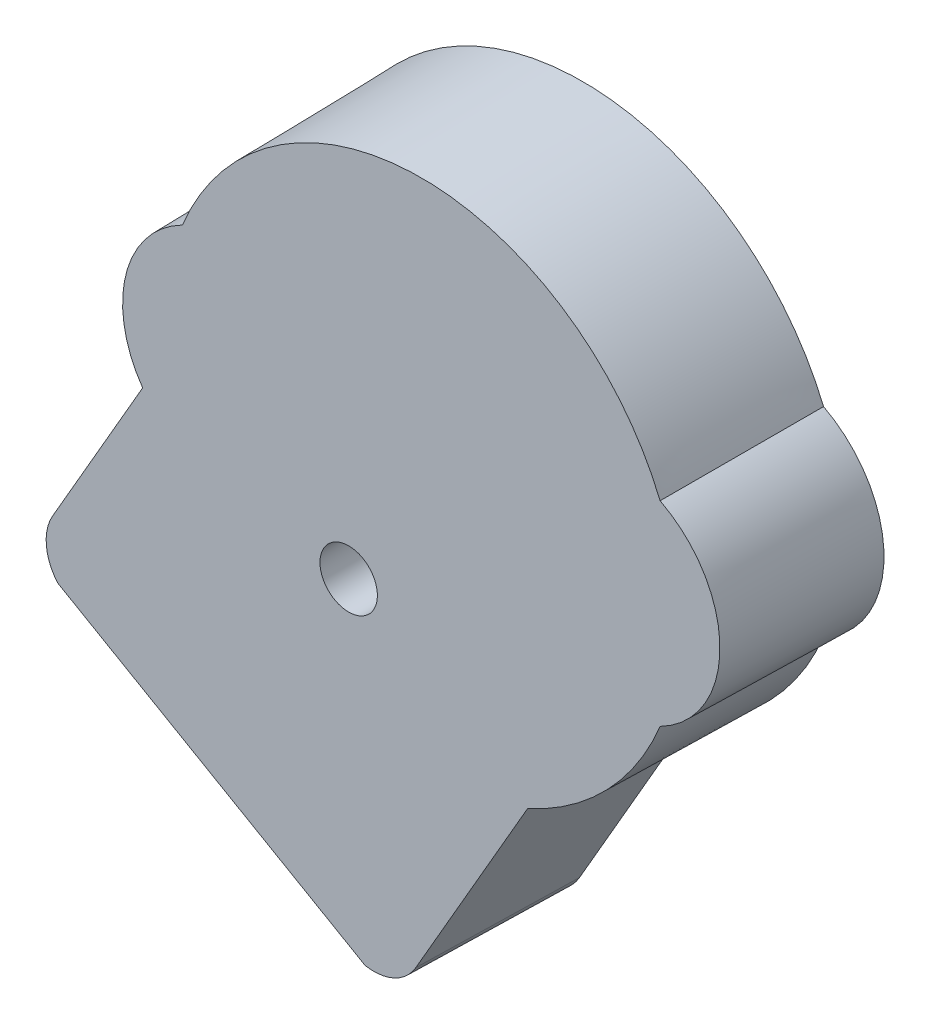
ISO-10303-21;
HEADER;
FILE_DESCRIPTION(('STEP AP214'),'2;1');
FILE_NAME('part.step','',(''),(''),'','','');
FILE_SCHEMA(('AUTOMOTIVE_DESIGN { 1 0 10303 214 1 1 1 1 }'));
ENDSEC;
DATA;
#1=APPLICATION_CONTEXT('core data for automotive mechanical design processes');
#2=APPLICATION_PROTOCOL_DEFINITION('international standard','automotive_design',2000,#1);
#3=PRODUCT_CONTEXT('',#1,'mechanical');
#4=PRODUCT('Part','Part','',(#3));
#5=PRODUCT_RELATED_PRODUCT_CATEGORY('part','',(#4));
#6=PRODUCT_DEFINITION_FORMATION('','',#4);
#7=PRODUCT_DEFINITION_CONTEXT('part definition',#1,'design');
#8=PRODUCT_DEFINITION('design','',#6,#7);
#9=PRODUCT_DEFINITION_SHAPE('','',#8);
#10=(LENGTH_UNIT() NAMED_UNIT(*) SI_UNIT(.MILLI.,.METRE.));
#11=(NAMED_UNIT(*) PLANE_ANGLE_UNIT() SI_UNIT($,.RADIAN.));
#12=(NAMED_UNIT(*) SI_UNIT($,.STERADIAN.) SOLID_ANGLE_UNIT());
#13=UNCERTAINTY_MEASURE_WITH_UNIT(LENGTH_MEASURE(1.E-05),#10,'distance_accuracy_value','');
#14=(GEOMETRIC_REPRESENTATION_CONTEXT(3) GLOBAL_UNCERTAINTY_ASSIGNED_CONTEXT((#13)) GLOBAL_UNIT_ASSIGNED_CONTEXT((#10,
#11,#12)) REPRESENTATION_CONTEXT('',''));
#15=CARTESIAN_POINT('',(0.,0.,0.));
#16=DIRECTION('',(0.,0.,1.));
#17=DIRECTION('',(1.,0.,0.));
#18=AXIS2_PLACEMENT_3D('',#15,#16,#17);
#19=CARTESIAN_POINT('',(-9.40359146757676,3.84682564082614,6.35));
#20=DIRECTION('',(0.,0.,1.));
#21=DIRECTION('',(1.,0.,0.));
#22=AXIS2_PLACEMENT_3D('',#19,#20,#21);
#23=PLANE('',#22);
#24=CARTESIAN_POINT('',(-2.8575,-4.94933518262807,6.35));
#25=DIRECTION('',(0.,0.,1.));
#26=DIRECTION('',(1.,0.,0.));
#27=AXIS2_PLACEMENT_3D('',#24,#25,#26);
#28=CIRCLE('',#27,1.1303);
#29=CARTESIAN_POINT('',(-1.7272,-4.94933518262807,6.35));
#30=VERTEX_POINT('',#29);
#31=EDGE_CURVE('E137',#30,#30,#28,.F.);
#32=ORIENTED_EDGE('',*,*,#31,.T.);
#33=EDGE_LOOP('',(#32));
#34=FACE_BOUND('',#33,.T.);
#35=CARTESIAN_POINT('',(-1.86673868596883,-15.9332862485524,6.35));
#36=DIRECTION('',(0.,0.,1.));
#37=DIRECTION('',(1.,0.,0.));
#38=AXIS2_PLACEMENT_3D('',#35,#36,#37);
#39=CIRCLE('',#38,1.905);
#40=CARTESIAN_POINT('',(-0.216960291759535,-16.8857862485523,6.35));
#41=VERTEX_POINT('',#40);
#42=CARTESIAN_POINT('',(-2.20928277668747,-17.8072362334543,6.35));
#43=VERTEX_POINT('',#42);
#44=EDGE_CURVE('E115',#41,#43,#39,.F.);
#45=ORIENTED_EDGE('',*,*,#44,.F.);
#46=DIRECTION('',(-0.5,-0.866025403784438,0.));
#47=VECTOR('',#46,1.);
#48=CARTESIAN_POINT('',(5.90942251977703,-6.27457995235447,6.35));
#49=LINE('',#48,#47);
#50=CARTESIAN_POINT('',(4.18759685888483,-9.25686947879562,6.35));
#51=VERTEX_POINT('',#50);
#52=EDGE_CURVE('E132',#41,#51,#49,.F.);
#53=ORIENTED_EDGE('',*,*,#52,.T.);
#54=CARTESIAN_POINT('',(0.,0.,6.35));
#55=DIRECTION('',(0.,0.,1.));
#56=DIRECTION('',(1.,0.,0.));
#57=AXIS2_PLACEMENT_3D('',#54,#55,#56);
#58=CIRCLE('',#57,10.16);
#59=CARTESIAN_POINT('',(9.40359146757677,-3.84682564082612,6.35));
#60=VERTEX_POINT('',#59);
#61=EDGE_CURVE('E136',#51,#60,#58,.T.);
#62=ORIENTED_EDGE('',*,*,#61,.T.);
#63=CARTESIAN_POINT('',(7.4422,0.,6.35));
#64=DIRECTION('',(0.,0.,1.));
#65=DIRECTION('',(1.,0.,0.));
#66=AXIS2_PLACEMENT_3D('',#63,#64,#65);
#67=CIRCLE('',#66,4.318);
#68=CARTESIAN_POINT('',(9.40359146757679,3.84682564082607,6.35));
#69=VERTEX_POINT('',#68);
#70=EDGE_CURVE('E84',#69,#60,#67,.F.);
#71=ORIENTED_EDGE('',*,*,#70,.F.);
#72=CARTESIAN_POINT('',(0.,0.,6.35));
#73=DIRECTION('',(0.,0.,1.));
#74=DIRECTION('',(1.,0.,0.));
#75=AXIS2_PLACEMENT_3D('',#72,#73,#74);
#76=CIRCLE('',#75,10.16);
#77=CARTESIAN_POINT('',(-9.40359146757677,3.84682564082612,6.35));
#78=VERTEX_POINT('',#77);
#79=EDGE_CURVE('E116',#69,#78,#76,.T.);
#80=ORIENTED_EDGE('',*,*,#79,.T.);
#81=CARTESIAN_POINT('',(-7.4422,0.,6.35));
#82=DIRECTION('',(0.,0.,1.));
#83=DIRECTION('',(1.,0.,0.));
#84=AXIS2_PLACEMENT_3D('',#81,#82,#83);
#85=CIRCLE('',#84,4.318);
#86=CARTESIAN_POINT('',(-10.9697880402554,-2.49023023398381,6.35));
#87=VERTEX_POINT('',#86);
#88=EDGE_CURVE('E123',#87,#78,#85,.F.);
#89=ORIENTED_EDGE('',*,*,#88,.F.);
#90=DIRECTION('',(0.5,0.866025403784438,0.));
#91=VECTOR('',#90,1.);
#92=CARTESIAN_POINT('',(-8.38865689670405,1.98042004764553,6.35));
#93=LINE('',#92,#91);
#94=CARTESIAN_POINT('',(-14.5150397082405,-8.63078624855234,6.35));
#95=VERTEX_POINT('',#94);
#96=EDGE_CURVE('E111',#87,#95,#93,.F.);
#97=ORIENTED_EDGE('',*,*,#96,.T.);
#98=CARTESIAN_POINT('',(-12.8652613140312,-9.58328624855235,6.35));
#99=DIRECTION('',(0.,0.,1.));
#100=DIRECTION('',(1.,0.,0.));
#101=AXIS2_PLACEMENT_3D('',#98,#99,#100);
#102=CIRCLE('',#101,1.905);
#103=CARTESIAN_POINT('',(-14.3168775610183,-10.8169131254819,6.35));
#104=VERTEX_POINT('',#103);
#105=EDGE_CURVE('E119',#104,#95,#102,.F.);
#106=ORIENTED_EDGE('',*,*,#105,.F.);
#107=DIRECTION('',(-0.866025403784439,0.5,0.));
#108=VECTOR('',#107,1.);
#109=CARTESIAN_POINT('',(0.36870169844507,-19.2956362641387,6.35));
#110=LINE('',#109,#108);
#111=EDGE_CURVE('E124',#43,#104,#110,.T.);
#112=ORIENTED_EDGE('',*,*,#111,.F.);
#113=EDGE_LOOP('',(#45,#53,#62,#71,#80,#89,#97,#106,#112));
#114=FACE_BOUND('',#113,.T.);
#115=ADVANCED_FACE('F17',(#34,#114),#23,.T.);
#116=CARTESIAN_POINT('',(-1.86673868596883,-15.9332862485524,0.));
#117=DIRECTION('',(0.,0.,-1.));
#118=DIRECTION('',(1.,0.,0.));
#119=AXIS2_PLACEMENT_3D('',#116,#117,#118);
#120=CONICAL_SURFACE('',#119,2.01583966229418,0.0174532925199433);
#121=CARTESIAN_POINT('',(-0.216960291747509,-16.8857862485592,6.34999999920876));
#122=DIRECTION('',(0.0151142273318586,-0.00872620321864211,-0.999847695156391));
#123=VECTOR('',#122,1.);
#124=LINE('',#121,#123);
#125=CARTESIAN_POINT('',(-0.120970328465817,-16.9412060796994,0.));
#126=VERTEX_POINT('',#125);
#127=EDGE_CURVE('E38',#41,#126,#124,.T.);
#128=ORIENTED_EDGE('',*,*,#127,.F.);
#129=ORIENTED_EDGE('',*,*,#44,.T.);
#130=CARTESIAN_POINT('',(-2.20928277668747,-17.8072362334543,6.35));
#131=CARTESIAN_POINT('',(-2.21691007592208,-17.8279869152819,5.10198016647171));
#132=CARTESIAN_POINT('',(-2.22456490869139,-17.8487217025208,3.85396023843436));
#133=CARTESIAN_POINT('',(-2.23759435433918,-17.883861355459,1.73729352304294));
#134=CARTESIAN_POINT('',(-2.24295477212802,-17.8982744157151,0.868646784413625));
#135=CARTESIAN_POINT('',(-2.2483285283619,-17.9126797759391,0.));
#136=B_SPLINE_CURVE_WITH_KNOTS('',3,(#130,#131,#132,#133,#134,#135),.UNSPECIFIED.,.F.,.F.,(4,2,
4),(0.,3.74464690161894,6.35099542824493),.UNSPECIFIED.);
#137=CARTESIAN_POINT('',(-2.2483285283619,-17.9126797759391,0.));
#138=VERTEX_POINT('',#137);
#139=EDGE_CURVE('E174',#43,#138,#136,.T.);
#140=ORIENTED_EDGE('',*,*,#139,.T.);
#141=CARTESIAN_POINT('',(-1.86673868596883,-15.9332862485524,0.));
#142=DIRECTION('',(0.,0.,-1.));
#143=DIRECTION('',(-1.,0.,0.));
#144=AXIS2_PLACEMENT_3D('',#141,#142,#143);
#145=CIRCLE('',#144,2.01583966229418);
#146=EDGE_CURVE('E29',#126,#138,#145,.T.);
#147=ORIENTED_EDGE('',*,*,#146,.F.);
#148=EDGE_LOOP('',(#128,#129,#140,#147));
#149=FACE_BOUND('',#148,.T.);
#150=ADVANCED_FACE('F197',(#149),#120,.T.);
#151=CARTESIAN_POINT('',(0.313281867297979,-19.3916262274323,0.));
#152=DIRECTION('',(-0.499923847578195,-0.865893503920755,0.0174524064372835));
#153=DIRECTION('',(0.866025403784439,-0.5,0.));
#154=AXIS2_PLACEMENT_3D('',#151,#152,#153);
#155=PLANE('',#154);
#156=ORIENTED_EDGE('',*,*,#139,.F.);
#157=ORIENTED_EDGE('',*,*,#111,.T.);
#158=CARTESIAN_POINT('',(-14.3168775610183,-10.8169131254819,6.35));
#159=CARTESIAN_POINT('',(-14.3310345290096,-10.8338939012952,5.10198016647171));
#160=CARTESIAN_POINT('',(-14.3451639651159,-10.8508905745546,3.85396023843436));
#161=CARTESIAN_POINT('',(-14.3690810744167,-10.8797442319519,1.73729352304294));
#162=CARTESIAN_POINT('',(-14.3788829418503,-10.89159302006,0.868646784413625));
#163=CARTESIAN_POINT('',(-14.3886714716381,-10.9034495095843,0.));
#164=B_SPLINE_CURVE_WITH_KNOTS('',3,(#158,#159,#160,#161,#162,#163),.UNSPECIFIED.,.F.,.F.,(4,2,
4),(0.,3.74464690161894,6.35099542824493),.UNSPECIFIED.);
#165=CARTESIAN_POINT('',(-14.3886714716381,-10.9034495095843,0.));
#166=VERTEX_POINT('',#165);
#167=EDGE_CURVE('E297',#104,#166,#164,.T.);
#168=ORIENTED_EDGE('',*,*,#167,.T.);
#169=DIRECTION('',(-0.866025403784439,0.5,0.));
#170=VECTOR('',#169,1.);
#171=CARTESIAN_POINT('',(-7.78487525556792,-14.7161530326058,0.));
#172=LINE('',#171,#170);
#173=EDGE_CURVE('E11',#138,#166,#172,.T.);
#174=ORIENTED_EDGE('',*,*,#173,.F.);
#175=EDGE_LOOP('',(#156,#157,#168,#174));
#176=FACE_BOUND('',#175,.T.);
#177=ADVANCED_FACE('F263',(#176),#155,.T.);
#178=CARTESIAN_POINT('',(-12.8652613140312,-9.58328624855235,0.));
#179=DIRECTION('',(0.,0.,-1.));
#180=DIRECTION('',(1.,0.,0.));
#181=AXIS2_PLACEMENT_3D('',#178,#179,#180);
#182=CONICAL_SURFACE('',#181,2.01583966229418,0.0174532925199433);
#183=ORIENTED_EDGE('',*,*,#167,.F.);
#184=ORIENTED_EDGE('',*,*,#105,.T.);
#185=CARTESIAN_POINT('',(-14.5150397082406,-8.63078624855234,6.34999999999999));
#186=DIRECTION('',(-0.0151142273318585,0.00872620321864185,-0.999847695156391));
#187=VECTOR('',#186,1.);
#188=LINE('',#185,#187);
#189=CARTESIAN_POINT('',(-14.6110296715342,-8.57536641740525,0.));
#190=VERTEX_POINT('',#189);
#191=EDGE_CURVE('E300',#95,#190,#188,.T.);
#192=ORIENTED_EDGE('',*,*,#191,.T.);
#193=CARTESIAN_POINT('',(-12.8652613140312,-9.58328624855235,0.));
#194=DIRECTION('',(0.,0.,-1.));
#195=DIRECTION('',(-1.,0.,0.));
#196=AXIS2_PLACEMENT_3D('',#193,#194,#195);
#197=CIRCLE('',#196,2.01583966229418);
#198=EDGE_CURVE('E93',#166,#190,#197,.T.);
#199=ORIENTED_EDGE('',*,*,#198,.F.);
#200=EDGE_LOOP('',(#183,#184,#192,#199));
#201=FACE_BOUND('',#200,.T.);
#202=ADVANCED_FACE('F267',(#201),#182,.T.);
#203=CARTESIAN_POINT('',(-8.4846468599977,2.03583987879263,0.));
#204=DIRECTION('',(-0.865893503920754,0.499923847578196,0.0174524064372835));
#205=DIRECTION('',(-0.5,-0.866025403784438,0.));
#206=AXIS2_PLACEMENT_3D('',#203,#204,#205);
#207=PLANE('',#206);
#208=ORIENTED_EDGE('',*,*,#96,.F.);
#209=CARTESIAN_POINT('',(-10.9697880402554,-2.49023023398381,6.35));
#210=CARTESIAN_POINT('',(-10.9916951584966,-2.49122796191585,5.29166781788123));
#211=CARTESIAN_POINT('',(-11.013576273421,-2.49218063068718,4.23333506013897));
#212=CARTESIAN_POINT('',(-11.0572864966353,-2.49399584990839,2.11666839347231));
#213=CARTESIAN_POINT('',(-11.0791156049251,-2.49485840035826,1.05833448454789));
#214=CARTESIAN_POINT('',(-11.1009187098983,-2.49567589164744,0.));
#215=B_SPLINE_CURVE_WITH_KNOTS('',3,(#209,#210,#211,#212,#213,#214),.UNSPECIFIED.,.F.,.F.,(4,2,
4),(0.,3.17567807749873,6.35135615480303),.UNSPECIFIED.);
#216=CARTESIAN_POINT('',(-11.1009187098983,-2.49567589164744,0.));
#217=VERTEX_POINT('',#216);
#218=EDGE_CURVE('E304',#87,#217,#215,.T.);
#219=ORIENTED_EDGE('',*,*,#218,.T.);
#220=DIRECTION('',(0.5,0.866025403784438,0.));
#221=VECTOR('',#220,1.);
#222=CARTESIAN_POINT('',(-9.28368507298185,0.651865096715026,0.));
#223=LINE('',#222,#221);
#224=EDGE_CURVE('E106',#217,#190,#223,.F.);
#225=ORIENTED_EDGE('',*,*,#224,.T.);
#226=ORIENTED_EDGE('',*,*,#191,.F.);
#227=EDGE_LOOP('',(#208,#219,#225,#226));
#228=FACE_BOUND('',#227,.T.);
#229=ADVANCED_FACE('F320',(#228),#207,.T.);
#230=CARTESIAN_POINT('',(-7.4422,0.,0.));
#231=DIRECTION('',(0.,0.,-1.));
#232=DIRECTION('',(1.,0.,0.));
#233=AXIS2_PLACEMENT_3D('',#230,#231,#232);
#234=CONICAL_SURFACE('',#233,4.42883966229418,0.0174532925199433);
#235=ORIENTED_EDGE('',*,*,#218,.F.);
#236=ORIENTED_EDGE('',*,*,#88,.T.);
#237=CARTESIAN_POINT('',(-9.40359146757677,3.84682564082612,6.35));
#238=CARTESIAN_POINT('',(-9.41809266877391,3.8601674526583,5.2916671136783));
#239=CARTESIAN_POINT('',(-9.43259387299244,3.87349148414208,4.2333340038486));
#240=CARTESIAN_POINT('',(-9.46159628747215,3.90010398641272,2.11666733718193));
#241=CARTESIAN_POINT('',(-9.47609749773333,3.91339245719959,1.05833378034497));
#242=CARTESIAN_POINT('',(-9.49059871101589,3.92666314763806,0.));
#243=B_SPLINE_CURVE_WITH_KNOTS('',3,(#237,#238,#239,#240,#241,#242),.UNSPECIFIED.,.F.,.F.,(4,2,
4),(0.,3.17554894071956,6.35109788141292),.UNSPECIFIED.);
#244=CARTESIAN_POINT('',(-9.49059871101589,3.92666314763806,0.));
#245=VERTEX_POINT('',#244);
#246=EDGE_CURVE('E185',#78,#245,#243,.T.);
#247=ORIENTED_EDGE('',*,*,#246,.T.);
#248=CARTESIAN_POINT('',(-7.4422,0.,0.));
#249=DIRECTION('',(0.,0.,-1.));
#250=DIRECTION('',(-1.,0.,0.));
#251=AXIS2_PLACEMENT_3D('',#248,#249,#250);
#252=CIRCLE('',#251,4.42883966229418);
#253=EDGE_CURVE('E153',#217,#245,#252,.T.);
#254=ORIENTED_EDGE('',*,*,#253,.F.);
#255=EDGE_LOOP('',(#235,#236,#247,#254));
#256=FACE_BOUND('',#255,.T.);
#257=ADVANCED_FACE('F19',(#256),#234,.T.);
#258=CARTESIAN_POINT('',(0.,0.,0.));
#259=DIRECTION('',(0.,0.,-1.));
#260=DIRECTION('',(1.,0.,0.));
#261=AXIS2_PLACEMENT_3D('',#258,#259,#260);
#262=CONICAL_SURFACE('',#261,10.2708396622942,0.0174532925199433);
#263=ORIENTED_EDGE('',*,*,#79,.F.);
#264=CARTESIAN_POINT('',(9.40359146757679,3.84682564082607,6.35));
#265=CARTESIAN_POINT('',(9.41809266877393,3.86016745265825,5.2916671136783));
#266=CARTESIAN_POINT('',(9.43259387299246,3.87349148414203,4.2333340038486));
#267=CARTESIAN_POINT('',(9.46159628747217,3.90010398641267,2.11666733718193));
#268=CARTESIAN_POINT('',(9.47609749773335,3.91339245719954,1.05833378034497));
#269=CARTESIAN_POINT('',(9.49059871101591,3.926663147638,0.));
#270=B_SPLINE_CURVE_WITH_KNOTS('',3,(#264,#265,#266,#267,#268,#269),.UNSPECIFIED.,.F.,.F.,(4,2,
4),(0.,3.17554894071957,6.35109788141292),.UNSPECIFIED.);
#271=CARTESIAN_POINT('',(9.49059871101591,3.926663147638,0.));
#272=VERTEX_POINT('',#271);
#273=EDGE_CURVE('E65',#69,#272,#270,.T.);
#274=ORIENTED_EDGE('',*,*,#273,.T.);
#275=CARTESIAN_POINT('',(0.,0.,0.));
#276=DIRECTION('',(0.,0.,-1.));
#277=DIRECTION('',(-1.,0.,0.));
#278=AXIS2_PLACEMENT_3D('',#275,#276,#277);
#279=CIRCLE('',#278,10.2708396622942);
#280=EDGE_CURVE('E98',#272,#245,#279,.F.);
#281=ORIENTED_EDGE('',*,*,#280,.T.);
#282=ORIENTED_EDGE('',*,*,#246,.F.);
#283=EDGE_LOOP('',(#263,#274,#281,#282));
#284=FACE_BOUND('',#283,.T.);
#285=ADVANCED_FACE('F196',(#284),#262,.T.);
#286=CARTESIAN_POINT('',(7.4422,0.,0.));
#287=DIRECTION('',(0.,0.,-1.));
#288=DIRECTION('',(1.,0.,0.));
#289=AXIS2_PLACEMENT_3D('',#286,#287,#288);
#290=CONICAL_SURFACE('',#289,4.42883966229418,0.0174532925199433);
#291=ORIENTED_EDGE('',*,*,#273,.F.);
#292=ORIENTED_EDGE('',*,*,#70,.T.);
#293=CARTESIAN_POINT('',(9.40359146757677,-3.84682564082612,6.35));
#294=CARTESIAN_POINT('',(9.41809266877391,-3.8601674526583,5.2916671136783));
#295=CARTESIAN_POINT('',(9.43259387299244,-3.87349148414208,4.2333340038486));
#296=CARTESIAN_POINT('',(9.46159628747215,-3.90010398641272,2.11666733718193));
#297=CARTESIAN_POINT('',(9.47609749773333,-3.91339245719959,1.05833378034497));
#298=CARTESIAN_POINT('',(9.49059871101589,-3.92666314763806,0.));
#299=B_SPLINE_CURVE_WITH_KNOTS('',3,(#293,#294,#295,#296,#297,#298),.UNSPECIFIED.,.F.,.F.,(4,2,
4),(0.,3.17554894071956,6.35109788141292),.UNSPECIFIED.);
#300=CARTESIAN_POINT('',(9.49059871101589,-3.92666314763806,0.));
#301=VERTEX_POINT('',#300);
#302=EDGE_CURVE('E77',#60,#301,#299,.T.);
#303=ORIENTED_EDGE('',*,*,#302,.T.);
#304=CARTESIAN_POINT('',(7.4422,0.,0.));
#305=DIRECTION('',(0.,0.,-1.));
#306=DIRECTION('',(-1.,0.,0.));
#307=AXIS2_PLACEMENT_3D('',#304,#305,#306);
#308=CIRCLE('',#307,4.42883966229418);
#309=EDGE_CURVE('E80',#272,#301,#308,.T.);
#310=ORIENTED_EDGE('',*,*,#309,.F.);
#311=EDGE_LOOP('',(#291,#292,#303,#310));
#312=FACE_BOUND('',#311,.T.);
#313=ADVANCED_FACE('F78',(#312),#290,.T.);
#314=ORIENTED_EDGE('',*,*,#61,.F.);
#315=CARTESIAN_POINT('',(4.18759685888483,-9.25686947879562,6.35));
#316=CARTESIAN_POINT('',(4.20062439668945,-9.27125167205691,5.29166676582508));
#317=CARTESIAN_POINT('',(4.21365636542677,-9.28562619244849,4.23333348207075));
#318=CARTESIAN_POINT('',(4.23972916476677,-9.31435988749217,2.11666681540409));
#319=CARTESIAN_POINT('',(4.25276999536946,-9.32871906214428,1.05833343249175));
#320=CARTESIAN_POINT('',(4.26581525690485,-9.34307056392667,0.));
#321=B_SPLINE_CURVE_WITH_KNOTS('',3,(#315,#316,#317,#318,#319,#320),.UNSPECIFIED.,.F.,.F.,(4,2,
4),(0.,3.17553337046407,6.35106674092572),.UNSPECIFIED.);
#322=CARTESIAN_POINT('',(4.26581525690485,-9.34307056392667,0.));
#323=VERTEX_POINT('',#322);
#324=EDGE_CURVE('E72',#51,#323,#321,.T.);
#325=ORIENTED_EDGE('',*,*,#324,.T.);
#326=CARTESIAN_POINT('',(0.,0.,0.));
#327=DIRECTION('',(0.,0.,-1.));
#328=DIRECTION('',(-1.,0.,0.));
#329=AXIS2_PLACEMENT_3D('',#326,#327,#328);
#330=CIRCLE('',#329,10.2708396622942);
#331=EDGE_CURVE('E89',#323,#301,#330,.F.);
#332=ORIENTED_EDGE('',*,*,#331,.T.);
#333=ORIENTED_EDGE('',*,*,#302,.F.);
#334=EDGE_LOOP('',(#314,#325,#332,#333));
#335=FACE_BOUND('',#334,.T.);
#336=ADVANCED_FACE('F90',(#335),#262,.T.);
#337=CARTESIAN_POINT('',(6.00541248307068,-6.32999978350156,0.));
#338=DIRECTION('',(0.865893503920754,-0.499923847578196,0.0174524064372835));
#339=DIRECTION('',(0.5,0.866025403784438,0.));
#340=AXIS2_PLACEMENT_3D('',#337,#338,#339);
#341=PLANE('',#340);
#342=ORIENTED_EDGE('',*,*,#52,.F.);
#343=ORIENTED_EDGE('',*,*,#127,.T.);
#344=DIRECTION('',(-0.5,-0.866025403784438,0.));
#345=VECTOR('',#344,1.);
#346=CARTESIAN_POINT('',(5.20637427008653,-7.71397456557916,0.));
#347=LINE('',#346,#345);
#348=EDGE_CURVE('E100',#126,#323,#347,.F.);
#349=ORIENTED_EDGE('',*,*,#348,.T.);
#350=ORIENTED_EDGE('',*,*,#324,.F.);
#351=EDGE_LOOP('',(#342,#343,#349,#350));
#352=FACE_BOUND('',#351,.T.);
#353=ADVANCED_FACE('F216',(#352),#341,.T.);
#354=CARTESIAN_POINT('',(-1.50503065701558,-3.83914312427618,0.));
#355=DIRECTION('',(0.,0.,-1.));
#356=DIRECTION('',(1.,0.,0.));
#357=AXIS2_PLACEMENT_3D('',#354,#355,#356);
#358=PLANE('',#357);
#359=CARTESIAN_POINT('',(7.4422,0.,0.));
#360=DIRECTION('',(0.,0.,-1.));
#361=DIRECTION('',(-1.,0.,0.));
#362=AXIS2_PLACEMENT_3D('',#359,#360,#361);
#363=CIRCLE('',#362,1.3208);
#364=CARTESIAN_POINT('',(6.1214,0.,0.));
#365=VERTEX_POINT('',#364);
#366=EDGE_CURVE('E473',#365,#365,#363,.T.);
#367=ORIENTED_EDGE('',*,*,#366,.F.);
#368=EDGE_LOOP('',(#367));
#369=FACE_BOUND('',#368,.T.);
#370=CARTESIAN_POINT('',(-7.4422,0.,0.));
#371=DIRECTION('',(0.,0.,-1.));
#372=DIRECTION('',(-1.,0.,0.));
#373=AXIS2_PLACEMENT_3D('',#370,#371,#372);
#374=CIRCLE('',#373,1.3208);
#375=CARTESIAN_POINT('',(-8.763,0.,0.));
#376=VERTEX_POINT('',#375);
#377=EDGE_CURVE('E481',#376,#376,#374,.T.);
#378=ORIENTED_EDGE('',*,*,#377,.F.);
#379=EDGE_LOOP('',(#378));
#380=FACE_BOUND('',#379,.T.);
#381=CARTESIAN_POINT('',(0.,0.,0.));
#382=DIRECTION('',(0.,0.,-1.));
#383=DIRECTION('',(-1.,0.,0.));
#384=AXIS2_PLACEMENT_3D('',#381,#382,#383);
#385=CIRCLE('',#384,3.3655);
#386=CARTESIAN_POINT('',(-3.3655,0.,0.));
#387=VERTEX_POINT('',#386);
#388=EDGE_CURVE('E460',#387,#387,#385,.T.);
#389=ORIENTED_EDGE('',*,*,#388,.F.);
#390=EDGE_LOOP('',(#389));
#391=FACE_BOUND('',#390,.T.);
#392=CARTESIAN_POINT('',(-2.8575,-4.94933518262807,0.));
#393=DIRECTION('',(0.,0.,-1.));
#394=DIRECTION('',(-1.,0.,0.));
#395=AXIS2_PLACEMENT_3D('',#392,#393,#394);
#396=CIRCLE('',#395,1.1303);
#397=CARTESIAN_POINT('',(-3.9878,-4.94933518262807,0.));
#398=VERTEX_POINT('',#397);
#399=EDGE_CURVE('E22',#398,#398,#396,.F.);
#400=ORIENTED_EDGE('',*,*,#399,.T.);
#401=EDGE_LOOP('',(#400));
#402=FACE_BOUND('',#401,.T.);
#403=ORIENTED_EDGE('',*,*,#146,.T.);
#404=ORIENTED_EDGE('',*,*,#173,.T.);
#405=ORIENTED_EDGE('',*,*,#198,.T.);
#406=ORIENTED_EDGE('',*,*,#224,.F.);
#407=ORIENTED_EDGE('',*,*,#253,.T.);
#408=ORIENTED_EDGE('',*,*,#280,.F.);
#409=ORIENTED_EDGE('',*,*,#309,.T.);
#410=ORIENTED_EDGE('',*,*,#331,.F.);
#411=ORIENTED_EDGE('',*,*,#348,.F.);
#412=EDGE_LOOP('',(#403,#404,#405,#406,#407,#408,#409,#410,#411));
#413=FACE_BOUND('',#412,.T.);
#414=ADVANCED_FACE('F96',(#369,#380,#391,#402,#413),#358,.T.);
#415=CARTESIAN_POINT('',(-2.8575,-4.94933518262807,13.0302));
#416=DIRECTION('',(0.,0.,-1.));
#417=DIRECTION('',(-1.,0.,0.));
#418=AXIS2_PLACEMENT_3D('',#415,#416,#417);
#419=CYLINDRICAL_SURFACE('',#418,1.1303);
#420=ORIENTED_EDGE('',*,*,#31,.F.);
#421=EDGE_LOOP('',(#420));
#422=FACE_BOUND('',#421,.T.);
#423=ORIENTED_EDGE('',*,*,#399,.F.);
#424=EDGE_LOOP('',(#423));
#425=FACE_BOUND('',#424,.T.);
#426=ADVANCED_FACE('F229',(#422,#425),#419,.F.);
#427=CARTESIAN_POINT('',(0.,0.,0.635));
#428=DIRECTION('',(0.,0.,1.));
#429=DIRECTION('',(-0.5,-0.866025403784438,0.));
#430=AXIS2_PLACEMENT_3D('',#427,#428,#429);
#431=PLANE('',#430);
#432=CARTESIAN_POINT('',(0.,0.,0.635));
#433=DIRECTION('',(0.,0.,1.));
#434=DIRECTION('',(1.,0.,0.));
#435=AXIS2_PLACEMENT_3D('',#432,#433,#434);
#436=CIRCLE('',#435,3.3655);
#437=CARTESIAN_POINT('',(3.3655,0.,0.635));
#438=VERTEX_POINT('',#437);
#439=EDGE_CURVE('E458',#438,#438,#436,.F.);
#440=ORIENTED_EDGE('',*,*,#439,.T.);
#441=EDGE_LOOP('',(#440));
#442=FACE_BOUND('',#441,.T.);
#443=ADVANCED_FACE('F235',(#442),#431,.F.);
#444=CARTESIAN_POINT('',(0.,0.,0.637));
#445=DIRECTION('',(0.,0.,-1.));
#446=DIRECTION('',(-1.,0.,0.));
#447=AXIS2_PLACEMENT_3D('',#444,#445,#446);
#448=CYLINDRICAL_SURFACE('',#447,3.3655);
#449=ORIENTED_EDGE('',*,*,#388,.T.);
#450=EDGE_LOOP('',(#449));
#451=FACE_BOUND('',#450,.T.);
#452=ORIENTED_EDGE('',*,*,#439,.F.);
#453=EDGE_LOOP('',(#452));
#454=FACE_BOUND('',#453,.T.);
#455=ADVANCED_FACE('F237',(#451,#454),#448,.F.);
#456=CARTESIAN_POINT('',(0.,0.,0.635));
#457=DIRECTION('',(0.,0.,1.));
#458=DIRECTION('',(-0.5,-0.866025403784438,0.));
#459=AXIS2_PLACEMENT_3D('',#456,#457,#458);
#460=PLANE('',#459);
#461=CARTESIAN_POINT('',(-7.4422,0.,0.635));
#462=DIRECTION('',(0.,0.,1.));
#463=DIRECTION('',(1.,0.,0.));
#464=AXIS2_PLACEMENT_3D('',#461,#462,#463);
#465=CIRCLE('',#464,1.3208);
#466=CARTESIAN_POINT('',(-6.1214,0.,0.635));
#467=VERTEX_POINT('',#466);
#468=EDGE_CURVE('E465',#467,#467,#465,.F.);
#469=ORIENTED_EDGE('',*,*,#468,.T.);
#470=EDGE_LOOP('',(#469));
#471=FACE_BOUND('',#470,.T.);
#472=ADVANCED_FACE('F240',(#471),#460,.F.);
#473=CARTESIAN_POINT('',(-7.4422,0.,0.637));
#474=DIRECTION('',(0.,0.,-1.));
#475=DIRECTION('',(-1.,0.,0.));
#476=AXIS2_PLACEMENT_3D('',#473,#474,#475);
#477=CYLINDRICAL_SURFACE('',#476,1.3208);
#478=ORIENTED_EDGE('',*,*,#377,.T.);
#479=EDGE_LOOP('',(#478));
#480=FACE_BOUND('',#479,.T.);
#481=ORIENTED_EDGE('',*,*,#468,.F.);
#482=EDGE_LOOP('',(#481));
#483=FACE_BOUND('',#482,.T.);
#484=ADVANCED_FACE('F245',(#480,#483),#477,.F.);
#485=CARTESIAN_POINT('',(0.,0.,0.635));
#486=DIRECTION('',(0.,0.,1.));
#487=DIRECTION('',(-0.5,-0.866025403784438,0.));
#488=AXIS2_PLACEMENT_3D('',#485,#486,#487);
#489=PLANE('',#488);
#490=CARTESIAN_POINT('',(7.4422,0.,0.635));
#491=DIRECTION('',(0.,0.,1.));
#492=DIRECTION('',(1.,0.,0.));
#493=AXIS2_PLACEMENT_3D('',#490,#491,#492);
#494=CIRCLE('',#493,1.3208);
#495=CARTESIAN_POINT('',(8.763,0.,0.635));
#496=VERTEX_POINT('',#495);
#497=EDGE_CURVE('E477',#496,#496,#494,.F.);
#498=ORIENTED_EDGE('',*,*,#497,.T.);
#499=EDGE_LOOP('',(#498));
#500=FACE_BOUND('',#499,.T.);
#501=ADVANCED_FACE('F248',(#500),#489,.F.);
#502=CARTESIAN_POINT('',(7.4422,0.,0.637));
#503=DIRECTION('',(0.,0.,-1.));
#504=DIRECTION('',(-1.,0.,0.));
#505=AXIS2_PLACEMENT_3D('',#502,#503,#504);
#506=CYLINDRICAL_SURFACE('',#505,1.3208);
#507=ORIENTED_EDGE('',*,*,#366,.T.);
#508=EDGE_LOOP('',(#507));
#509=FACE_BOUND('',#508,.T.);
#510=ORIENTED_EDGE('',*,*,#497,.F.);
#511=EDGE_LOOP('',(#510));
#512=FACE_BOUND('',#511,.T.);
#513=ADVANCED_FACE('F253',(#509,#512),#506,.F.);
#514=CLOSED_SHELL('',(#115,#150,#177,#202,#229,#257,#285,#313,#336,#353,#414,#426,#443,#455,
#472,#484,#501,#513));
#515=MANIFOLD_SOLID_BREP('B1',#514);
#516=ADVANCED_BREP_SHAPE_REPRESENTATION('',(#18,#515),#14);
#517=SHAPE_DEFINITION_REPRESENTATION(#9,#516);
ENDSEC;
END-ISO-10303-21;
